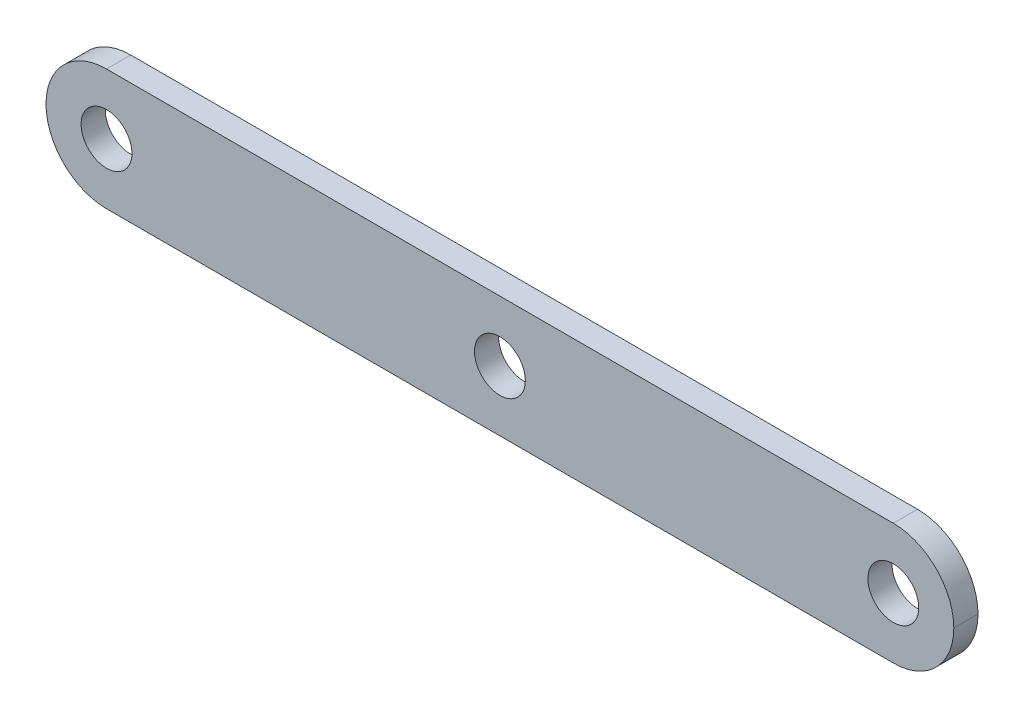
ISO-10303-21;
HEADER;
FILE_DESCRIPTION(('STEP AP214'),'2;1');
FILE_NAME('part.step','',(''),(''),'','','');
FILE_SCHEMA(('AUTOMOTIVE_DESIGN { 1 0 10303 214 1 1 1 1 }'));
ENDSEC;
DATA;
#1=APPLICATION_CONTEXT('core data for automotive mechanical design processes');
#2=APPLICATION_PROTOCOL_DEFINITION('international standard','automotive_design',2000,#1);
#3=PRODUCT_CONTEXT('',#1,'mechanical');
#4=PRODUCT('Part','Part','',(#3));
#5=PRODUCT_RELATED_PRODUCT_CATEGORY('part','',(#4));
#6=PRODUCT_DEFINITION_FORMATION('','',#4);
#7=PRODUCT_DEFINITION_CONTEXT('part definition',#1,'design');
#8=PRODUCT_DEFINITION('design','',#6,#7);
#9=PRODUCT_DEFINITION_SHAPE('','',#8);
#10=(LENGTH_UNIT() NAMED_UNIT(*) SI_UNIT(.MILLI.,.METRE.));
#11=(NAMED_UNIT(*) PLANE_ANGLE_UNIT() SI_UNIT($,.RADIAN.));
#12=(NAMED_UNIT(*) SI_UNIT($,.STERADIAN.) SOLID_ANGLE_UNIT());
#13=UNCERTAINTY_MEASURE_WITH_UNIT(LENGTH_MEASURE(1.E-05),#10,'distance_accuracy_value','');
#14=(GEOMETRIC_REPRESENTATION_CONTEXT(3) GLOBAL_UNCERTAINTY_ASSIGNED_CONTEXT((#13)) GLOBAL_UNIT_ASSIGNED_CONTEXT((#10,
#11,#12)) REPRESENTATION_CONTEXT('',''));
#15=CARTESIAN_POINT('',(0.,0.,0.));
#16=DIRECTION('',(0.,0.,1.));
#17=DIRECTION('',(1.,0.,0.));
#18=AXIS2_PLACEMENT_3D('',#15,#16,#17);
#19=CARTESIAN_POINT('',(-37.5,5.,-2.));
#20=DIRECTION('',(0.,-1.,0.));
#21=DIRECTION('',(0.,0.,1.));
#22=AXIS2_PLACEMENT_3D('',#19,#20,#21);
#23=PLANE('',#22);
#24=DIRECTION('',(-1.,0.,0.));
#25=VECTOR('',#24,1.);
#26=CARTESIAN_POINT('',(-37.5,5.,0.));
#27=LINE('',#26,#25);
#28=CARTESIAN_POINT('',(32.5,5.,0.));
#29=VERTEX_POINT('',#28);
#30=CARTESIAN_POINT('',(-32.5,5.,0.));
#31=VERTEX_POINT('',#30);
#32=EDGE_CURVE('E100',#29,#31,#27,.T.);
#33=ORIENTED_EDGE('',*,*,#32,.F.);
#34=DIRECTION('',(0.,0.,1.));
#35=VECTOR('',#34,1.);
#36=CARTESIAN_POINT('',(32.5,5.,-2.));
#37=LINE('',#36,#35);
#38=CARTESIAN_POINT('',(32.5,5.,-2.));
#39=VERTEX_POINT('',#38);
#40=EDGE_CURVE('E46',#39,#29,#37,.T.);
#41=ORIENTED_EDGE('',*,*,#40,.F.);
#42=DIRECTION('',(-1.,0.,0.));
#43=VECTOR('',#42,1.);
#44=CARTESIAN_POINT('',(-37.5,5.,-2.));
#45=LINE('',#44,#43);
#46=CARTESIAN_POINT('',(-32.5,5.,-2.));
#47=VERTEX_POINT('',#46);
#48=EDGE_CURVE('E138',#39,#47,#45,.T.);
#49=ORIENTED_EDGE('',*,*,#48,.T.);
#50=DIRECTION('',(0.,0.,1.));
#51=VECTOR('',#50,1.);
#52=CARTESIAN_POINT('',(-32.5,5.,-2.));
#53=LINE('',#52,#51);
#54=EDGE_CURVE('E11',#31,#47,#53,.F.);
#55=ORIENTED_EDGE('',*,*,#54,.F.);
#56=EDGE_LOOP('',(#33,#41,#49,#55));
#57=FACE_BOUND('',#56,.T.);
#58=ADVANCED_FACE('F37',(#57),#23,.F.);
#59=CARTESIAN_POINT('',(-37.5,-5.,-2.));
#60=DIRECTION('',(0.,1.,0.));
#61=DIRECTION('',(0.,0.,-1.));
#62=AXIS2_PLACEMENT_3D('',#59,#60,#61);
#63=PLANE('',#62);
#64=DIRECTION('',(1.,0.,0.));
#65=VECTOR('',#64,1.);
#66=CARTESIAN_POINT('',(-37.5,-5.,0.));
#67=LINE('',#66,#65);
#68=CARTESIAN_POINT('',(-32.5,-5.,0.));
#69=VERTEX_POINT('',#68);
#70=CARTESIAN_POINT('',(32.5,-5.,0.));
#71=VERTEX_POINT('',#70);
#72=EDGE_CURVE('E113',#69,#71,#67,.T.);
#73=ORIENTED_EDGE('',*,*,#72,.F.);
#74=DIRECTION('',(0.,0.,1.));
#75=VECTOR('',#74,1.);
#76=CARTESIAN_POINT('',(-32.5,-5.,-2.));
#77=LINE('',#76,#75);
#78=CARTESIAN_POINT('',(-32.5,-5.,-2.));
#79=VERTEX_POINT('',#78);
#80=EDGE_CURVE('E121',#79,#69,#77,.T.);
#81=ORIENTED_EDGE('',*,*,#80,.F.);
#82=DIRECTION('',(1.,0.,0.));
#83=VECTOR('',#82,1.);
#84=CARTESIAN_POINT('',(-37.5,-5.,-2.));
#85=LINE('',#84,#83);
#86=CARTESIAN_POINT('',(32.5,-5.,-2.));
#87=VERTEX_POINT('',#86);
#88=EDGE_CURVE('E108',#79,#87,#85,.T.);
#89=ORIENTED_EDGE('',*,*,#88,.T.);
#90=DIRECTION('',(0.,0.,1.));
#91=VECTOR('',#90,1.);
#92=CARTESIAN_POINT('',(32.5,-5.,-2.));
#93=LINE('',#92,#91);
#94=EDGE_CURVE('E124',#71,#87,#93,.F.);
#95=ORIENTED_EDGE('',*,*,#94,.F.);
#96=EDGE_LOOP('',(#73,#81,#89,#95));
#97=FACE_BOUND('',#96,.T.);
#98=ADVANCED_FACE('F140',(#97),#63,.F.);
#99=CARTESIAN_POINT('',(0.,0.,-2.));
#100=DIRECTION('',(0.,0.,1.));
#101=DIRECTION('',(-1.,0.,0.));
#102=AXIS2_PLACEMENT_3D('',#99,#100,#101);
#103=PLANE('',#102);
#104=CARTESIAN_POINT('',(32.5,0.,-2.));
#105=DIRECTION('',(0.,0.,1.));
#106=DIRECTION('',(-1.,0.,0.));
#107=AXIS2_PLACEMENT_3D('',#104,#105,#106);
#108=CIRCLE('',#107,2.1);
#109=CARTESIAN_POINT('',(30.4,0.,-2.));
#110=VERTEX_POINT('',#109);
#111=EDGE_CURVE('E158',#110,#110,#108,.T.);
#112=ORIENTED_EDGE('',*,*,#111,.T.);
#113=EDGE_LOOP('',(#112));
#114=FACE_BOUND('',#113,.T.);
#115=CARTESIAN_POINT('',(0.,0.,-2.));
#116=DIRECTION('',(0.,0.,1.));
#117=DIRECTION('',(1.,0.,0.));
#118=AXIS2_PLACEMENT_3D('',#115,#116,#117);
#119=CIRCLE('',#118,2.1);
#120=CARTESIAN_POINT('',(2.1,0.,-2.));
#121=VERTEX_POINT('',#120);
#122=EDGE_CURVE('E152',#121,#121,#119,.T.);
#123=ORIENTED_EDGE('',*,*,#122,.T.);
#124=EDGE_LOOP('',(#123));
#125=FACE_BOUND('',#124,.T.);
#126=CARTESIAN_POINT('',(-32.5,0.,-2.));
#127=DIRECTION('',(0.,0.,1.));
#128=DIRECTION('',(1.,0.,0.));
#129=AXIS2_PLACEMENT_3D('',#126,#127,#128);
#130=CIRCLE('',#129,2.1);
#131=CARTESIAN_POINT('',(-30.4,0.,-2.));
#132=VERTEX_POINT('',#131);
#133=EDGE_CURVE('E145',#132,#132,#130,.T.);
#134=ORIENTED_EDGE('',*,*,#133,.T.);
#135=EDGE_LOOP('',(#134));
#136=FACE_BOUND('',#135,.T.);
#137=CARTESIAN_POINT('',(-32.5,0.,-2.));
#138=DIRECTION('',(0.,0.,-1.));
#139=DIRECTION('',(-1.,0.,0.));
#140=AXIS2_PLACEMENT_3D('',#137,#138,#139);
#141=CIRCLE('',#140,5.);
#142=CARTESIAN_POINT('',(-37.5,0.,-2.));
#143=VERTEX_POINT('',#142);
#144=EDGE_CURVE('E60',#47,#143,#141,.F.);
#145=ORIENTED_EDGE('',*,*,#144,.F.);
#146=ORIENTED_EDGE('',*,*,#48,.F.);
#147=CARTESIAN_POINT('',(32.5,0.,-2.));
#148=DIRECTION('',(0.,0.,-1.));
#149=DIRECTION('',(-1.,0.,0.));
#150=AXIS2_PLACEMENT_3D('',#147,#148,#149);
#151=CIRCLE('',#150,5.);
#152=CARTESIAN_POINT('',(37.5,0.,-2.));
#153=VERTEX_POINT('',#152);
#154=EDGE_CURVE('E126',#153,#39,#151,.F.);
#155=ORIENTED_EDGE('',*,*,#154,.F.);
#156=CARTESIAN_POINT('',(32.5,0.,-2.));
#157=DIRECTION('',(0.,0.,-1.));
#158=DIRECTION('',(-1.,0.,0.));
#159=AXIS2_PLACEMENT_3D('',#156,#157,#158);
#160=CIRCLE('',#159,5.);
#161=EDGE_CURVE('E97',#87,#153,#160,.F.);
#162=ORIENTED_EDGE('',*,*,#161,.F.);
#163=ORIENTED_EDGE('',*,*,#88,.F.);
#164=CARTESIAN_POINT('',(-32.5,0.,-2.));
#165=DIRECTION('',(0.,0.,-1.));
#166=DIRECTION('',(-1.,0.,0.));
#167=AXIS2_PLACEMENT_3D('',#164,#165,#166);
#168=CIRCLE('',#167,5.);
#169=EDGE_CURVE('E130',#143,#79,#168,.F.);
#170=ORIENTED_EDGE('',*,*,#169,.F.);
#171=EDGE_LOOP('',(#145,#146,#155,#162,#163,#170));
#172=FACE_BOUND('',#171,.T.);
#173=ADVANCED_FACE('F136',(#114,#125,#136,#172),#103,.F.);
#174=CARTESIAN_POINT('',(0.,0.,0.));
#175=DIRECTION('',(0.,0.,1.));
#176=DIRECTION('',(-1.,0.,0.));
#177=AXIS2_PLACEMENT_3D('',#174,#175,#176);
#178=PLANE('',#177);
#179=CARTESIAN_POINT('',(32.5,0.,0.));
#180=DIRECTION('',(0.,0.,1.));
#181=DIRECTION('',(-1.,0.,0.));
#182=AXIS2_PLACEMENT_3D('',#179,#180,#181);
#183=CIRCLE('',#182,2.1);
#184=CARTESIAN_POINT('',(30.4,0.,0.));
#185=VERTEX_POINT('',#184);
#186=EDGE_CURVE('E149',#185,#185,#183,.T.);
#187=ORIENTED_EDGE('',*,*,#186,.F.);
#188=EDGE_LOOP('',(#187));
#189=FACE_BOUND('',#188,.T.);
#190=CARTESIAN_POINT('',(0.,0.,0.));
#191=DIRECTION('',(0.,0.,1.));
#192=DIRECTION('',(1.,0.,0.));
#193=AXIS2_PLACEMENT_3D('',#190,#191,#192);
#194=CIRCLE('',#193,2.1);
#195=CARTESIAN_POINT('',(2.1,0.,0.));
#196=VERTEX_POINT('',#195);
#197=EDGE_CURVE('E155',#196,#196,#194,.T.);
#198=ORIENTED_EDGE('',*,*,#197,.F.);
#199=EDGE_LOOP('',(#198));
#200=FACE_BOUND('',#199,.T.);
#201=CARTESIAN_POINT('',(-32.5,0.,0.));
#202=DIRECTION('',(0.,0.,1.));
#203=DIRECTION('',(1.,0.,0.));
#204=AXIS2_PLACEMENT_3D('',#201,#202,#203);
#205=CIRCLE('',#204,2.1);
#206=CARTESIAN_POINT('',(-30.4,0.,0.));
#207=VERTEX_POINT('',#206);
#208=EDGE_CURVE('E148',#207,#207,#205,.T.);
#209=ORIENTED_EDGE('',*,*,#208,.F.);
#210=EDGE_LOOP('',(#209));
#211=FACE_BOUND('',#210,.T.);
#212=ORIENTED_EDGE('',*,*,#72,.T.);
#213=CARTESIAN_POINT('',(32.5,0.,0.));
#214=DIRECTION('',(0.,0.,-1.));
#215=DIRECTION('',(-1.,0.,0.));
#216=AXIS2_PLACEMENT_3D('',#213,#214,#215);
#217=CIRCLE('',#216,5.);
#218=CARTESIAN_POINT('',(37.5,0.,0.));
#219=VERTEX_POINT('',#218);
#220=EDGE_CURVE('E95',#219,#71,#217,.T.);
#221=ORIENTED_EDGE('',*,*,#220,.F.);
#222=CARTESIAN_POINT('',(32.5,0.,0.));
#223=DIRECTION('',(0.,0.,-1.));
#224=DIRECTION('',(-1.,0.,0.));
#225=AXIS2_PLACEMENT_3D('',#222,#223,#224);
#226=CIRCLE('',#225,5.);
#227=EDGE_CURVE('E102',#29,#219,#226,.T.);
#228=ORIENTED_EDGE('',*,*,#227,.F.);
#229=ORIENTED_EDGE('',*,*,#32,.T.);
#230=CARTESIAN_POINT('',(-32.5,0.,0.));
#231=DIRECTION('',(0.,0.,-1.));
#232=DIRECTION('',(-1.,0.,0.));
#233=AXIS2_PLACEMENT_3D('',#230,#231,#232);
#234=CIRCLE('',#233,5.);
#235=CARTESIAN_POINT('',(-37.5,0.,0.));
#236=VERTEX_POINT('',#235);
#237=EDGE_CURVE('E114',#236,#31,#234,.T.);
#238=ORIENTED_EDGE('',*,*,#237,.F.);
#239=CARTESIAN_POINT('',(-32.5,0.,0.));
#240=DIRECTION('',(0.,0.,-1.));
#241=DIRECTION('',(-1.,0.,0.));
#242=AXIS2_PLACEMENT_3D('',#239,#240,#241);
#243=CIRCLE('',#242,5.);
#244=EDGE_CURVE('E116',#69,#236,#243,.T.);
#245=ORIENTED_EDGE('',*,*,#244,.F.);
#246=EDGE_LOOP('',(#212,#221,#228,#229,#238,#245));
#247=FACE_BOUND('',#246,.T.);
#248=ADVANCED_FACE('F111',(#189,#200,#211,#247),#178,.T.);
#249=CARTESIAN_POINT('',(32.5,0.,-2.));
#250=DIRECTION('',(0.,0.,1.));
#251=DIRECTION('',(-1.,0.,0.));
#252=AXIS2_PLACEMENT_3D('',#249,#250,#251);
#253=CYLINDRICAL_SURFACE('',#252,5.);
#254=ORIENTED_EDGE('',*,*,#40,.T.);
#255=ORIENTED_EDGE('',*,*,#227,.T.);
#256=DIRECTION('',(0.,0.,1.));
#257=VECTOR('',#256,1.);
#258=CARTESIAN_POINT('',(37.5,0.,-2.));
#259=LINE('',#258,#257);
#260=EDGE_CURVE('E90',#219,#153,#259,.F.);
#261=ORIENTED_EDGE('',*,*,#260,.T.);
#262=ORIENTED_EDGE('',*,*,#154,.T.);
#263=EDGE_LOOP('',(#254,#255,#261,#262));
#264=FACE_BOUND('',#263,.T.);
#265=ADVANCED_FACE('F103',(#264),#253,.T.);
#266=CARTESIAN_POINT('',(32.5,0.,-2.));
#267=DIRECTION('',(0.,0.,1.));
#268=DIRECTION('',(-1.,0.,0.));
#269=AXIS2_PLACEMENT_3D('',#266,#267,#268);
#270=CYLINDRICAL_SURFACE('',#269,5.);
#271=ORIENTED_EDGE('',*,*,#161,.T.);
#272=ORIENTED_EDGE('',*,*,#260,.F.);
#273=ORIENTED_EDGE('',*,*,#220,.T.);
#274=ORIENTED_EDGE('',*,*,#94,.T.);
#275=EDGE_LOOP('',(#271,#272,#273,#274));
#276=FACE_BOUND('',#275,.T.);
#277=ADVANCED_FACE('F92',(#276),#270,.T.);
#278=CARTESIAN_POINT('',(-32.5,0.,-2.));
#279=DIRECTION('',(0.,0.,1.));
#280=DIRECTION('',(-1.,0.,0.));
#281=AXIS2_PLACEMENT_3D('',#278,#279,#280);
#282=CYLINDRICAL_SURFACE('',#281,5.);
#283=DIRECTION('',(0.,0.,1.));
#284=VECTOR('',#283,1.);
#285=CARTESIAN_POINT('',(-37.5,0.,-2.));
#286=LINE('',#285,#284);
#287=EDGE_CURVE('E41',#143,#236,#286,.T.);
#288=ORIENTED_EDGE('',*,*,#287,.T.);
#289=ORIENTED_EDGE('',*,*,#237,.T.);
#290=ORIENTED_EDGE('',*,*,#54,.T.);
#291=ORIENTED_EDGE('',*,*,#144,.T.);
#292=EDGE_LOOP('',(#288,#289,#290,#291));
#293=FACE_BOUND('',#292,.T.);
#294=ADVANCED_FACE('F39',(#293),#282,.T.);
#295=CARTESIAN_POINT('',(-32.5,0.,-2.));
#296=DIRECTION('',(0.,0.,1.));
#297=DIRECTION('',(-1.,0.,0.));
#298=AXIS2_PLACEMENT_3D('',#295,#296,#297);
#299=CYLINDRICAL_SURFACE('',#298,5.);
#300=ORIENTED_EDGE('',*,*,#169,.T.);
#301=ORIENTED_EDGE('',*,*,#80,.T.);
#302=ORIENTED_EDGE('',*,*,#244,.T.);
#303=ORIENTED_EDGE('',*,*,#287,.F.);
#304=EDGE_LOOP('',(#300,#301,#302,#303));
#305=FACE_BOUND('',#304,.T.);
#306=ADVANCED_FACE('F133',(#305),#299,.T.);
#307=CARTESIAN_POINT('',(-32.5,0.,0.));
#308=DIRECTION('',(0.,0.,-1.));
#309=DIRECTION('',(1.,0.,0.));
#310=AXIS2_PLACEMENT_3D('',#307,#308,#309);
#311=CYLINDRICAL_SURFACE('',#310,2.1);
#312=ORIENTED_EDGE('',*,*,#208,.T.);
#313=EDGE_LOOP('',(#312));
#314=FACE_BOUND('',#313,.T.);
#315=ORIENTED_EDGE('',*,*,#133,.F.);
#316=EDGE_LOOP('',(#315));
#317=FACE_BOUND('',#316,.T.);
#318=ADVANCED_FACE('F174',(#314,#317),#311,.F.);
#319=CARTESIAN_POINT('',(0.,0.,0.));
#320=DIRECTION('',(0.,0.,-1.));
#321=DIRECTION('',(1.,0.,0.));
#322=AXIS2_PLACEMENT_3D('',#319,#320,#321);
#323=CYLINDRICAL_SURFACE('',#322,2.1);
#324=ORIENTED_EDGE('',*,*,#197,.T.);
#325=EDGE_LOOP('',(#324));
#326=FACE_BOUND('',#325,.T.);
#327=ORIENTED_EDGE('',*,*,#122,.F.);
#328=EDGE_LOOP('',(#327));
#329=FACE_BOUND('',#328,.T.);
#330=ADVANCED_FACE('F177',(#326,#329),#323,.F.);
#331=CARTESIAN_POINT('',(32.5,0.,0.));
#332=DIRECTION('',(0.,0.,-1.));
#333=DIRECTION('',(1.,0.,0.));
#334=AXIS2_PLACEMENT_3D('',#331,#332,#333);
#335=CYLINDRICAL_SURFACE('',#334,2.1);
#336=ORIENTED_EDGE('',*,*,#186,.T.);
#337=EDGE_LOOP('',(#336));
#338=FACE_BOUND('',#337,.T.);
#339=ORIENTED_EDGE('',*,*,#111,.F.);
#340=EDGE_LOOP('',(#339));
#341=FACE_BOUND('',#340,.T.);
#342=ADVANCED_FACE('F164',(#338,#341),#335,.F.);
#343=CLOSED_SHELL('',(#58,#98,#173,#248,#265,#277,#294,#306,#318,#330,#342));
#344=MANIFOLD_SOLID_BREP('B2',#343);
#345=ADVANCED_BREP_SHAPE_REPRESENTATION('',(#18,#344),#14);
#346=SHAPE_DEFINITION_REPRESENTATION(#9,#345);
ENDSEC;
END-ISO-10303-21;
